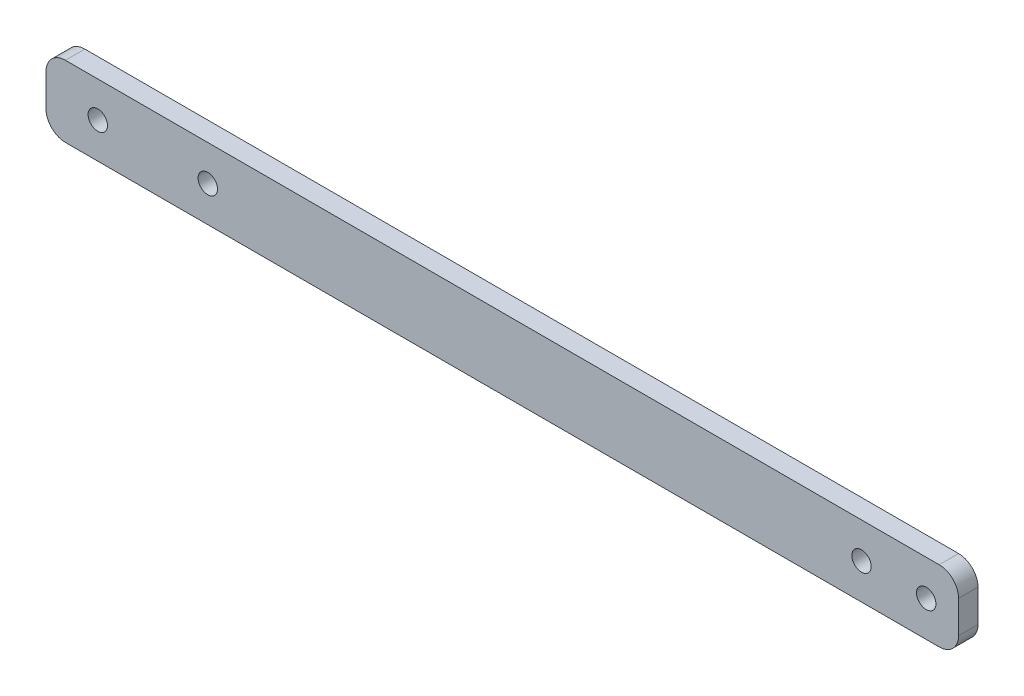
ISO-10303-21;
HEADER;
FILE_DESCRIPTION(('STEP AP214'),'2;1');
FILE_NAME('part.step','',(''),(''),'','','');
FILE_SCHEMA(('AUTOMOTIVE_DESIGN { 1 0 10303 214 1 1 1 1 }'));
ENDSEC;
DATA;
#1=APPLICATION_CONTEXT('core data for automotive mechanical design processes');
#2=APPLICATION_PROTOCOL_DEFINITION('international standard','automotive_design',2000,#1);
#3=PRODUCT_CONTEXT('',#1,'mechanical');
#4=PRODUCT('Part','Part','',(#3));
#5=PRODUCT_RELATED_PRODUCT_CATEGORY('part','',(#4));
#6=PRODUCT_DEFINITION_FORMATION('','',#4);
#7=PRODUCT_DEFINITION_CONTEXT('part definition',#1,'design');
#8=PRODUCT_DEFINITION('design','',#6,#7);
#9=PRODUCT_DEFINITION_SHAPE('','',#8);
#10=(LENGTH_UNIT() NAMED_UNIT(*) SI_UNIT(.MILLI.,.METRE.));
#11=(NAMED_UNIT(*) PLANE_ANGLE_UNIT() SI_UNIT($,.RADIAN.));
#12=(NAMED_UNIT(*) SI_UNIT($,.STERADIAN.) SOLID_ANGLE_UNIT());
#13=UNCERTAINTY_MEASURE_WITH_UNIT(LENGTH_MEASURE(1.E-05),#10,'distance_accuracy_value','');
#14=(GEOMETRIC_REPRESENTATION_CONTEXT(3) GLOBAL_UNCERTAINTY_ASSIGNED_CONTEXT((#13)) GLOBAL_UNIT_ASSIGNED_CONTEXT((#10,
#11,#12)) REPRESENTATION_CONTEXT('',''));
#15=CARTESIAN_POINT('',(0.,0.,0.));
#16=DIRECTION('',(0.,0.,1.));
#17=DIRECTION('',(1.,0.,0.));
#18=AXIS2_PLACEMENT_3D('',#15,#16,#17);
#19=CARTESIAN_POINT('',(0.,0.,3.));
#20=DIRECTION('',(0.,0.,1.));
#21=DIRECTION('',(1.,0.,0.));
#22=AXIS2_PLACEMENT_3D('',#19,#20,#21);
#23=PLANE('',#22);
#24=CARTESIAN_POINT('',(8.,-5.5,3.));
#25=DIRECTION('',(0.,0.,1.));
#26=DIRECTION('',(1.,0.,0.));
#27=AXIS2_PLACEMENT_3D('',#24,#25,#26);
#28=CIRCLE('',#27,1.5);
#29=CARTESIAN_POINT('',(9.5,-5.5,3.));
#30=VERTEX_POINT('',#29);
#31=EDGE_CURVE('E183',#30,#30,#28,.T.);
#32=ORIENTED_EDGE('',*,*,#31,.F.);
#33=EDGE_LOOP('',(#32));
#34=FACE_BOUND('',#33,.T.);
#35=CARTESIAN_POINT('',(126.,-5.5,3.));
#36=DIRECTION('',(0.,0.,1.));
#37=DIRECTION('',(1.,0.,0.));
#38=AXIS2_PLACEMENT_3D('',#35,#36,#37);
#39=CIRCLE('',#38,1.5);
#40=CARTESIAN_POINT('',(127.5,-5.5,3.));
#41=VERTEX_POINT('',#40);
#42=EDGE_CURVE('E166',#41,#41,#39,.T.);
#43=ORIENTED_EDGE('',*,*,#42,.F.);
#44=EDGE_LOOP('',(#43));
#45=FACE_BOUND('',#44,.T.);
#46=DIRECTION('',(1.,0.,0.));
#47=VECTOR('',#46,1.);
#48=CARTESIAN_POINT('',(0.,-11.,3.));
#49=LINE('',#48,#47);
#50=CARTESIAN_POINT('',(3.,-11.,3.));
#51=VERTEX_POINT('',#50);
#52=CARTESIAN_POINT('',(138.,-11.,3.));
#53=VERTEX_POINT('',#52);
#54=EDGE_CURVE('E173',#51,#53,#49,.T.);
#55=ORIENTED_EDGE('',*,*,#54,.T.);
#56=CARTESIAN_POINT('',(138.,-8.,3.));
#57=DIRECTION('',(0.,0.,1.));
#58=DIRECTION('',(1.,0.,0.));
#59=AXIS2_PLACEMENT_3D('',#56,#57,#58);
#60=CIRCLE('',#59,3.);
#61=CARTESIAN_POINT('',(141.,-8.,3.));
#62=VERTEX_POINT('',#61);
#63=EDGE_CURVE('E150',#53,#62,#60,.T.);
#64=ORIENTED_EDGE('',*,*,#63,.T.);
#65=DIRECTION('',(0.,1.,0.));
#66=VECTOR('',#65,1.);
#67=CARTESIAN_POINT('',(141.,0.,3.));
#68=LINE('',#67,#66);
#69=CARTESIAN_POINT('',(141.,-3.,3.));
#70=VERTEX_POINT('',#69);
#71=EDGE_CURVE('E120',#62,#70,#68,.T.);
#72=ORIENTED_EDGE('',*,*,#71,.T.);
#73=CARTESIAN_POINT('',(138.,-3.,3.));
#74=DIRECTION('',(0.,0.,1.));
#75=DIRECTION('',(1.,0.,0.));
#76=AXIS2_PLACEMENT_3D('',#73,#74,#75);
#77=CIRCLE('',#76,3.);
#78=CARTESIAN_POINT('',(138.,0.,3.));
#79=VERTEX_POINT('',#78);
#80=EDGE_CURVE('E57',#70,#79,#77,.T.);
#81=ORIENTED_EDGE('',*,*,#80,.T.);
#82=DIRECTION('',(-1.,0.,0.));
#83=VECTOR('',#82,1.);
#84=CARTESIAN_POINT('',(0.,0.,3.));
#85=LINE('',#84,#83);
#86=CARTESIAN_POINT('',(3.,0.,3.));
#87=VERTEX_POINT('',#86);
#88=EDGE_CURVE('E136',#79,#87,#85,.T.);
#89=ORIENTED_EDGE('',*,*,#88,.T.);
#90=CARTESIAN_POINT('',(3.,-3.,3.));
#91=DIRECTION('',(0.,0.,1.));
#92=DIRECTION('',(1.,0.,0.));
#93=AXIS2_PLACEMENT_3D('',#90,#91,#92);
#94=CIRCLE('',#93,3.);
#95=CARTESIAN_POINT('',(0.,-3.,3.));
#96=VERTEX_POINT('',#95);
#97=EDGE_CURVE('E145',#87,#96,#94,.T.);
#98=ORIENTED_EDGE('',*,*,#97,.T.);
#99=DIRECTION('',(0.,-1.,0.));
#100=VECTOR('',#99,1.);
#101=CARTESIAN_POINT('',(0.,0.,3.));
#102=LINE('',#101,#100);
#103=CARTESIAN_POINT('',(0.,-8.,3.));
#104=VERTEX_POINT('',#103);
#105=EDGE_CURVE('E130',#96,#104,#102,.T.);
#106=ORIENTED_EDGE('',*,*,#105,.T.);
#107=CARTESIAN_POINT('',(3.,-8.,3.));
#108=DIRECTION('',(0.,0.,1.));
#109=DIRECTION('',(1.,0.,0.));
#110=AXIS2_PLACEMENT_3D('',#107,#108,#109);
#111=CIRCLE('',#110,3.);
#112=EDGE_CURVE('E147',#104,#51,#111,.T.);
#113=ORIENTED_EDGE('',*,*,#112,.T.);
#114=EDGE_LOOP('',(#55,#64,#72,#81,#89,#98,#106,#113));
#115=FACE_BOUND('',#114,.T.);
#116=CARTESIAN_POINT('',(136.,-5.5,3.));
#117=DIRECTION('',(0.,0.,1.));
#118=DIRECTION('',(1.,0.,0.));
#119=AXIS2_PLACEMENT_3D('',#116,#117,#118);
#120=CIRCLE('',#119,1.5);
#121=CARTESIAN_POINT('',(137.5,-5.5,3.));
#122=VERTEX_POINT('',#121);
#123=EDGE_CURVE('E178',#122,#122,#120,.T.);
#124=ORIENTED_EDGE('',*,*,#123,.F.);
#125=EDGE_LOOP('',(#124));
#126=FACE_BOUND('',#125,.T.);
#127=CARTESIAN_POINT('',(25.,-5.5,3.));
#128=DIRECTION('',(0.,0.,1.));
#129=DIRECTION('',(1.,0.,0.));
#130=AXIS2_PLACEMENT_3D('',#127,#128,#129);
#131=CIRCLE('',#130,1.5);
#132=CARTESIAN_POINT('',(26.5,-5.5,3.));
#133=VERTEX_POINT('',#132);
#134=EDGE_CURVE('E189',#133,#133,#131,.T.);
#135=ORIENTED_EDGE('',*,*,#134,.F.);
#136=EDGE_LOOP('',(#135));
#137=FACE_BOUND('',#136,.T.);
#138=ADVANCED_FACE('F35',(#34,#45,#115,#126,#137),#23,.T.);
#139=CARTESIAN_POINT('',(0.,0.,0.));
#140=DIRECTION('',(0.,0.,1.));
#141=DIRECTION('',(1.,0.,0.));
#142=AXIS2_PLACEMENT_3D('',#139,#140,#141);
#143=PLANE('',#142);
#144=DIRECTION('',(0.,1.,0.));
#145=VECTOR('',#144,1.);
#146=CARTESIAN_POINT('',(141.,0.,0.));
#147=LINE('',#146,#145);
#148=CARTESIAN_POINT('',(141.,-8.,0.));
#149=VERTEX_POINT('',#148);
#150=CARTESIAN_POINT('',(141.,-3.,0.));
#151=VERTEX_POINT('',#150);
#152=EDGE_CURVE('E118',#149,#151,#147,.T.);
#153=ORIENTED_EDGE('',*,*,#152,.F.);
#154=CARTESIAN_POINT('',(138.,-8.,0.));
#155=DIRECTION('',(0.,0.,1.));
#156=DIRECTION('',(1.,0.,0.));
#157=AXIS2_PLACEMENT_3D('',#154,#155,#156);
#158=CIRCLE('',#157,3.);
#159=CARTESIAN_POINT('',(138.,-11.,0.));
#160=VERTEX_POINT('',#159);
#161=EDGE_CURVE('E101',#149,#160,#158,.F.);
#162=ORIENTED_EDGE('',*,*,#161,.T.);
#163=DIRECTION('',(1.,0.,0.));
#164=VECTOR('',#163,1.);
#165=CARTESIAN_POINT('',(0.,-11.,0.));
#166=LINE('',#165,#164);
#167=CARTESIAN_POINT('',(3.,-11.,0.));
#168=VERTEX_POINT('',#167);
#169=EDGE_CURVE('E128',#168,#160,#166,.T.);
#170=ORIENTED_EDGE('',*,*,#169,.F.);
#171=CARTESIAN_POINT('',(3.,-8.,0.));
#172=DIRECTION('',(0.,0.,1.));
#173=DIRECTION('',(1.,0.,0.));
#174=AXIS2_PLACEMENT_3D('',#171,#172,#173);
#175=CIRCLE('',#174,3.);
#176=CARTESIAN_POINT('',(0.,-8.,0.));
#177=VERTEX_POINT('',#176);
#178=EDGE_CURVE('E139',#168,#177,#175,.F.);
#179=ORIENTED_EDGE('',*,*,#178,.T.);
#180=DIRECTION('',(0.,-1.,0.));
#181=VECTOR('',#180,1.);
#182=CARTESIAN_POINT('',(0.,0.,0.));
#183=LINE('',#182,#181);
#184=CARTESIAN_POINT('',(0.,-3.,0.));
#185=VERTEX_POINT('',#184);
#186=EDGE_CURVE('E132',#185,#177,#183,.T.);
#187=ORIENTED_EDGE('',*,*,#186,.F.);
#188=CARTESIAN_POINT('',(3.,-3.,0.));
#189=DIRECTION('',(0.,0.,1.));
#190=DIRECTION('',(1.,0.,0.));
#191=AXIS2_PLACEMENT_3D('',#188,#189,#190);
#192=CIRCLE('',#191,3.);
#193=CARTESIAN_POINT('',(3.,0.,0.));
#194=VERTEX_POINT('',#193);
#195=EDGE_CURVE('E121',#185,#194,#192,.F.);
#196=ORIENTED_EDGE('',*,*,#195,.T.);
#197=DIRECTION('',(-1.,0.,0.));
#198=VECTOR('',#197,1.);
#199=CARTESIAN_POINT('',(0.,0.,0.));
#200=LINE('',#199,#198);
#201=CARTESIAN_POINT('',(138.,0.,0.));
#202=VERTEX_POINT('',#201);
#203=EDGE_CURVE('E127',#202,#194,#200,.T.);
#204=ORIENTED_EDGE('',*,*,#203,.F.);
#205=CARTESIAN_POINT('',(138.,-3.,0.));
#206=DIRECTION('',(0.,0.,1.));
#207=DIRECTION('',(1.,0.,0.));
#208=AXIS2_PLACEMENT_3D('',#205,#206,#207);
#209=CIRCLE('',#208,3.);
#210=EDGE_CURVE('E112',#202,#151,#209,.F.);
#211=ORIENTED_EDGE('',*,*,#210,.T.);
#212=EDGE_LOOP('',(#153,#162,#170,#179,#187,#196,#204,#211));
#213=FACE_BOUND('',#212,.T.);
#214=CARTESIAN_POINT('',(126.,-5.5,0.));
#215=DIRECTION('',(0.,0.,1.));
#216=DIRECTION('',(1.,0.,0.));
#217=AXIS2_PLACEMENT_3D('',#214,#215,#216);
#218=CIRCLE('',#217,1.5);
#219=CARTESIAN_POINT('',(127.5,-5.5,0.));
#220=VERTEX_POINT('',#219);
#221=EDGE_CURVE('E168',#220,#220,#218,.T.);
#222=ORIENTED_EDGE('',*,*,#221,.T.);
#223=EDGE_LOOP('',(#222));
#224=FACE_BOUND('',#223,.T.);
#225=CARTESIAN_POINT('',(136.,-5.5,0.));
#226=DIRECTION('',(0.,0.,1.));
#227=DIRECTION('',(1.,0.,0.));
#228=AXIS2_PLACEMENT_3D('',#225,#226,#227);
#229=CIRCLE('',#228,1.5);
#230=CARTESIAN_POINT('',(137.5,-5.5,0.));
#231=VERTEX_POINT('',#230);
#232=EDGE_CURVE('E180',#231,#231,#229,.T.);
#233=ORIENTED_EDGE('',*,*,#232,.T.);
#234=EDGE_LOOP('',(#233));
#235=FACE_BOUND('',#234,.T.);
#236=CARTESIAN_POINT('',(8.,-5.5,0.));
#237=DIRECTION('',(0.,0.,1.));
#238=DIRECTION('',(1.,0.,0.));
#239=AXIS2_PLACEMENT_3D('',#236,#237,#238);
#240=CIRCLE('',#239,1.5);
#241=CARTESIAN_POINT('',(9.5,-5.5,0.));
#242=VERTEX_POINT('',#241);
#243=EDGE_CURVE('E186',#242,#242,#240,.T.);
#244=ORIENTED_EDGE('',*,*,#243,.T.);
#245=EDGE_LOOP('',(#244));
#246=FACE_BOUND('',#245,.T.);
#247=CARTESIAN_POINT('',(25.,-5.5,0.));
#248=DIRECTION('',(0.,0.,1.));
#249=DIRECTION('',(1.,0.,0.));
#250=AXIS2_PLACEMENT_3D('',#247,#248,#249);
#251=CIRCLE('',#250,1.5);
#252=CARTESIAN_POINT('',(26.5,-5.5,0.));
#253=VERTEX_POINT('',#252);
#254=EDGE_CURVE('E192',#253,#253,#251,.T.);
#255=ORIENTED_EDGE('',*,*,#254,.T.);
#256=EDGE_LOOP('',(#255));
#257=FACE_BOUND('',#256,.T.);
#258=ADVANCED_FACE('F124',(#213,#224,#235,#246,#257),#143,.F.);
#259=CARTESIAN_POINT('',(0.,0.,3.));
#260=DIRECTION('',(1.,0.,0.));
#261=DIRECTION('',(0.,1.,0.));
#262=AXIS2_PLACEMENT_3D('',#259,#260,#261);
#263=PLANE('',#262);
#264=ORIENTED_EDGE('',*,*,#186,.T.);
#265=DIRECTION('',(0.,0.,-1.));
#266=VECTOR('',#265,1.);
#267=CARTESIAN_POINT('',(0.,-8.,3.));
#268=LINE('',#267,#266);
#269=EDGE_CURVE('E11',#177,#104,#268,.F.);
#270=ORIENTED_EDGE('',*,*,#269,.T.);
#271=ORIENTED_EDGE('',*,*,#105,.F.);
#272=DIRECTION('',(0.,0.,-1.));
#273=VECTOR('',#272,1.);
#274=CARTESIAN_POINT('',(0.,-3.,3.));
#275=LINE('',#274,#273);
#276=EDGE_CURVE('E43',#96,#185,#275,.T.);
#277=ORIENTED_EDGE('',*,*,#276,.T.);
#278=EDGE_LOOP('',(#264,#270,#271,#277));
#279=FACE_BOUND('',#278,.T.);
#280=ADVANCED_FACE('F161',(#279),#263,.F.);
#281=CARTESIAN_POINT('',(0.,-11.,3.));
#282=DIRECTION('',(0.,1.,0.));
#283=DIRECTION('',(0.,0.,1.));
#284=AXIS2_PLACEMENT_3D('',#281,#282,#283);
#285=PLANE('',#284);
#286=ORIENTED_EDGE('',*,*,#169,.T.);
#287=DIRECTION('',(0.,0.,-1.));
#288=VECTOR('',#287,1.);
#289=CARTESIAN_POINT('',(138.,-11.,3.));
#290=LINE('',#289,#288);
#291=EDGE_CURVE('E106',#160,#53,#290,.F.);
#292=ORIENTED_EDGE('',*,*,#291,.T.);
#293=ORIENTED_EDGE('',*,*,#54,.F.);
#294=DIRECTION('',(0.,0.,-1.));
#295=VECTOR('',#294,1.);
#296=CARTESIAN_POINT('',(3.,-11.,3.));
#297=LINE('',#296,#295);
#298=EDGE_CURVE('E111',#51,#168,#297,.T.);
#299=ORIENTED_EDGE('',*,*,#298,.T.);
#300=EDGE_LOOP('',(#286,#292,#293,#299));
#301=FACE_BOUND('',#300,.T.);
#302=ADVANCED_FACE('F219',(#301),#285,.F.);
#303=CARTESIAN_POINT('',(141.,0.,3.));
#304=DIRECTION('',(-1.,0.,0.));
#305=DIRECTION('',(0.,0.,1.));
#306=AXIS2_PLACEMENT_3D('',#303,#304,#305);
#307=PLANE('',#306);
#308=ORIENTED_EDGE('',*,*,#71,.F.);
#309=DIRECTION('',(0.,0.,-1.));
#310=VECTOR('',#309,1.);
#311=CARTESIAN_POINT('',(141.,-8.,3.));
#312=LINE('',#311,#310);
#313=EDGE_CURVE('E105',#62,#149,#312,.T.);
#314=ORIENTED_EDGE('',*,*,#313,.T.);
#315=ORIENTED_EDGE('',*,*,#152,.T.);
#316=DIRECTION('',(0.,0.,-1.));
#317=VECTOR('',#316,1.);
#318=CARTESIAN_POINT('',(141.,-3.,3.));
#319=LINE('',#318,#317);
#320=EDGE_CURVE('E122',#151,#70,#319,.F.);
#321=ORIENTED_EDGE('',*,*,#320,.T.);
#322=EDGE_LOOP('',(#308,#314,#315,#321));
#323=FACE_BOUND('',#322,.T.);
#324=ADVANCED_FACE('F117',(#323),#307,.F.);
#325=CARTESIAN_POINT('',(0.,0.,3.));
#326=DIRECTION('',(0.,-1.,0.));
#327=DIRECTION('',(0.,0.,-1.));
#328=AXIS2_PLACEMENT_3D('',#325,#326,#327);
#329=PLANE('',#328);
#330=ORIENTED_EDGE('',*,*,#88,.F.);
#331=DIRECTION('',(0.,0.,-1.));
#332=VECTOR('',#331,1.);
#333=CARTESIAN_POINT('',(138.,0.,3.));
#334=LINE('',#333,#332);
#335=EDGE_CURVE('E153',#79,#202,#334,.T.);
#336=ORIENTED_EDGE('',*,*,#335,.T.);
#337=ORIENTED_EDGE('',*,*,#203,.T.);
#338=DIRECTION('',(0.,0.,-1.));
#339=VECTOR('',#338,1.);
#340=CARTESIAN_POINT('',(3.,0.,3.));
#341=LINE('',#340,#339);
#342=EDGE_CURVE('E50',#194,#87,#341,.F.);
#343=ORIENTED_EDGE('',*,*,#342,.T.);
#344=EDGE_LOOP('',(#330,#336,#337,#343));
#345=FACE_BOUND('',#344,.T.);
#346=ADVANCED_FACE('F214',(#345),#329,.F.);
#347=CARTESIAN_POINT('',(126.,-5.5,3.));
#348=DIRECTION('',(0.,0.,-1.));
#349=DIRECTION('',(-1.,0.,0.));
#350=AXIS2_PLACEMENT_3D('',#347,#348,#349);
#351=CYLINDRICAL_SURFACE('',#350,1.5);
#352=ORIENTED_EDGE('',*,*,#42,.T.);
#353=EDGE_LOOP('',(#352));
#354=FACE_BOUND('',#353,.T.);
#355=ORIENTED_EDGE('',*,*,#221,.F.);
#356=EDGE_LOOP('',(#355));
#357=FACE_BOUND('',#356,.T.);
#358=ADVANCED_FACE('F211',(#354,#357),#351,.F.);
#359=CARTESIAN_POINT('',(136.,-5.5,3.));
#360=DIRECTION('',(0.,0.,-1.));
#361=DIRECTION('',(-1.,0.,0.));
#362=AXIS2_PLACEMENT_3D('',#359,#360,#361);
#363=CYLINDRICAL_SURFACE('',#362,1.5);
#364=ORIENTED_EDGE('',*,*,#123,.T.);
#365=EDGE_LOOP('',(#364));
#366=FACE_BOUND('',#365,.T.);
#367=ORIENTED_EDGE('',*,*,#232,.F.);
#368=EDGE_LOOP('',(#367));
#369=FACE_BOUND('',#368,.T.);
#370=ADVANCED_FACE('F243',(#366,#369),#363,.F.);
#371=CARTESIAN_POINT('',(8.,-5.5,3.));
#372=DIRECTION('',(0.,0.,-1.));
#373=DIRECTION('',(-1.,0.,0.));
#374=AXIS2_PLACEMENT_3D('',#371,#372,#373);
#375=CYLINDRICAL_SURFACE('',#374,1.5);
#376=ORIENTED_EDGE('',*,*,#31,.T.);
#377=EDGE_LOOP('',(#376));
#378=FACE_BOUND('',#377,.T.);
#379=ORIENTED_EDGE('',*,*,#243,.F.);
#380=EDGE_LOOP('',(#379));
#381=FACE_BOUND('',#380,.T.);
#382=ADVANCED_FACE('F246',(#378,#381),#375,.F.);
#383=CARTESIAN_POINT('',(25.,-5.5,3.));
#384=DIRECTION('',(0.,0.,-1.));
#385=DIRECTION('',(-1.,0.,0.));
#386=AXIS2_PLACEMENT_3D('',#383,#384,#385);
#387=CYLINDRICAL_SURFACE('',#386,1.5);
#388=ORIENTED_EDGE('',*,*,#134,.T.);
#389=EDGE_LOOP('',(#388));
#390=FACE_BOUND('',#389,.T.);
#391=ORIENTED_EDGE('',*,*,#254,.F.);
#392=EDGE_LOOP('',(#391));
#393=FACE_BOUND('',#392,.T.);
#394=ADVANCED_FACE('F198',(#390,#393),#387,.F.);
#395=CARTESIAN_POINT('',(138.,-8.,3.));
#396=DIRECTION('',(0.,0.,-1.));
#397=DIRECTION('',(-1.,0.,0.));
#398=AXIS2_PLACEMENT_3D('',#395,#396,#397);
#399=CYLINDRICAL_SURFACE('',#398,3.);
#400=ORIENTED_EDGE('',*,*,#63,.F.);
#401=ORIENTED_EDGE('',*,*,#291,.F.);
#402=ORIENTED_EDGE('',*,*,#161,.F.);
#403=ORIENTED_EDGE('',*,*,#313,.F.);
#404=EDGE_LOOP('',(#400,#401,#402,#403));
#405=FACE_BOUND('',#404,.T.);
#406=ADVANCED_FACE('F104',(#405),#399,.T.);
#407=CARTESIAN_POINT('',(138.,-3.,3.));
#408=DIRECTION('',(0.,0.,-1.));
#409=DIRECTION('',(-1.,0.,0.));
#410=AXIS2_PLACEMENT_3D('',#407,#408,#409);
#411=CYLINDRICAL_SURFACE('',#410,3.);
#412=ORIENTED_EDGE('',*,*,#80,.F.);
#413=ORIENTED_EDGE('',*,*,#320,.F.);
#414=ORIENTED_EDGE('',*,*,#210,.F.);
#415=ORIENTED_EDGE('',*,*,#335,.F.);
#416=EDGE_LOOP('',(#412,#413,#414,#415));
#417=FACE_BOUND('',#416,.T.);
#418=ADVANCED_FACE('F227',(#417),#411,.T.);
#419=CARTESIAN_POINT('',(3.,-8.,3.));
#420=DIRECTION('',(0.,0.,-1.));
#421=DIRECTION('',(-1.,0.,0.));
#422=AXIS2_PLACEMENT_3D('',#419,#420,#421);
#423=CYLINDRICAL_SURFACE('',#422,3.);
#424=ORIENTED_EDGE('',*,*,#112,.F.);
#425=ORIENTED_EDGE('',*,*,#269,.F.);
#426=ORIENTED_EDGE('',*,*,#178,.F.);
#427=ORIENTED_EDGE('',*,*,#298,.F.);
#428=EDGE_LOOP('',(#424,#425,#426,#427));
#429=FACE_BOUND('',#428,.T.);
#430=ADVANCED_FACE('F229',(#429),#423,.T.);
#431=CARTESIAN_POINT('',(3.,-3.,3.));
#432=DIRECTION('',(0.,0.,-1.));
#433=DIRECTION('',(-1.,0.,0.));
#434=AXIS2_PLACEMENT_3D('',#431,#432,#433);
#435=CYLINDRICAL_SURFACE('',#434,3.);
#436=ORIENTED_EDGE('',*,*,#97,.F.);
#437=ORIENTED_EDGE('',*,*,#342,.F.);
#438=ORIENTED_EDGE('',*,*,#195,.F.);
#439=ORIENTED_EDGE('',*,*,#276,.F.);
#440=EDGE_LOOP('',(#436,#437,#438,#439));
#441=FACE_BOUND('',#440,.T.);
#442=ADVANCED_FACE('F37',(#441),#435,.T.);
#443=CLOSED_SHELL('',(#138,#258,#280,#302,#324,#346,#358,#370,#382,#394,#406,#418,#430,#442));
#444=MANIFOLD_SOLID_BREP('B2',#443);
#445=ADVANCED_BREP_SHAPE_REPRESENTATION('',(#18,#444),#14);
#446=SHAPE_DEFINITION_REPRESENTATION(#9,#445);
ENDSEC;
END-ISO-10303-21;
